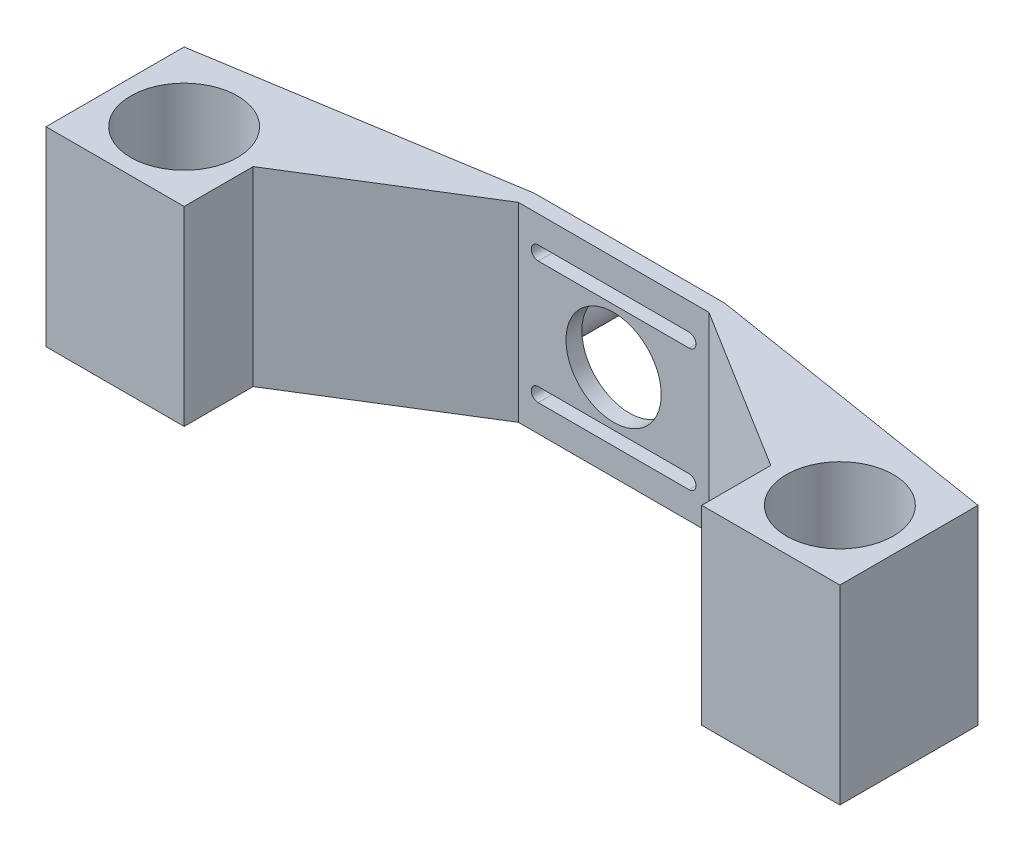
ISO-10303-21;
HEADER;
FILE_DESCRIPTION(('STEP AP214'),'2;1');
FILE_NAME('part.step','',(''),(''),'','','');
FILE_SCHEMA(('AUTOMOTIVE_DESIGN { 1 0 10303 214 1 1 1 1 }'));
ENDSEC;
DATA;
#1=APPLICATION_CONTEXT('core data for automotive mechanical design processes');
#2=APPLICATION_PROTOCOL_DEFINITION('international standard','automotive_design',2000,#1);
#3=PRODUCT_CONTEXT('',#1,'mechanical');
#4=PRODUCT('Part','Part','',(#3));
#5=PRODUCT_RELATED_PRODUCT_CATEGORY('part','',(#4));
#6=PRODUCT_DEFINITION_FORMATION('','',#4);
#7=PRODUCT_DEFINITION_CONTEXT('part definition',#1,'design');
#8=PRODUCT_DEFINITION('design','',#6,#7);
#9=PRODUCT_DEFINITION_SHAPE('','',#8);
#10=(LENGTH_UNIT() NAMED_UNIT(*) SI_UNIT(.MILLI.,.METRE.));
#11=(NAMED_UNIT(*) PLANE_ANGLE_UNIT() SI_UNIT($,.RADIAN.));
#12=(NAMED_UNIT(*) SI_UNIT($,.STERADIAN.) SOLID_ANGLE_UNIT());
#13=UNCERTAINTY_MEASURE_WITH_UNIT(LENGTH_MEASURE(1.E-05),#10,'distance_accuracy_value','');
#14=(GEOMETRIC_REPRESENTATION_CONTEXT(3) GLOBAL_UNCERTAINTY_ASSIGNED_CONTEXT((#13)) GLOBAL_UNIT_ASSIGNED_CONTEXT((#10,
#11,#12)) REPRESENTATION_CONTEXT('',''));
#15=CARTESIAN_POINT('',(0.,0.,0.));
#16=DIRECTION('',(0.,0.,1.));
#17=DIRECTION('',(1.,0.,0.));
#18=AXIS2_PLACEMENT_3D('',#15,#16,#17);
#19=CARTESIAN_POINT('',(82.6,48.,-29.6));
#20=DIRECTION('',(0.,0.,1.));
#21=DIRECTION('',(1.,0.,0.));
#22=AXIS2_PLACEMENT_3D('',#19,#20,#21);
#23=PLANE('',#22);
#24=DIRECTION('',(-1.,0.,0.));
#25=VECTOR('',#24,1.);
#26=CARTESIAN_POINT('',(101.6,6.8,-29.6));
#27=LINE('',#26,#25);
#28=CARTESIAN_POINT('',(101.6,6.8,-29.6));
#29=VERTEX_POINT('',#28);
#30=CARTESIAN_POINT('',(63.6,6.80000000000001,-29.6));
#31=VERTEX_POINT('',#30);
#32=EDGE_CURVE('E207',#29,#31,#27,.T.);
#33=ORIENTED_EDGE('',*,*,#32,.F.);
#34=CARTESIAN_POINT('',(101.6,8.55,-29.6));
#35=DIRECTION('',(0.,0.,-1.));
#36=DIRECTION('',(-1.,0.,0.));
#37=AXIS2_PLACEMENT_3D('',#34,#35,#36);
#38=CIRCLE('',#37,1.75);
#39=CARTESIAN_POINT('',(101.6,10.3,-29.6));
#40=VERTEX_POINT('',#39);
#41=EDGE_CURVE('E205',#40,#29,#38,.T.);
#42=ORIENTED_EDGE('',*,*,#41,.F.);
#43=DIRECTION('',(1.,0.,0.));
#44=VECTOR('',#43,1.);
#45=CARTESIAN_POINT('',(101.6,10.3,-29.6));
#46=LINE('',#45,#44);
#47=CARTESIAN_POINT('',(63.6,10.3,-29.6));
#48=VERTEX_POINT('',#47);
#49=EDGE_CURVE('E214',#48,#40,#46,.T.);
#50=ORIENTED_EDGE('',*,*,#49,.F.);
#51=CARTESIAN_POINT('',(63.6,8.55000000000001,-29.6));
#52=DIRECTION('',(0.,0.,-1.));
#53=DIRECTION('',(-1.,0.,0.));
#54=AXIS2_PLACEMENT_3D('',#51,#52,#53);
#55=CIRCLE('',#54,1.75);
#56=EDGE_CURVE('E211',#31,#48,#55,.T.);
#57=ORIENTED_EDGE('',*,*,#56,.F.);
#58=EDGE_LOOP('',(#33,#42,#50,#57));
#59=FACE_BOUND('',#58,.T.);
#60=DIRECTION('',(-1.,0.,0.));
#61=VECTOR('',#60,1.);
#62=CARTESIAN_POINT('',(101.6,37.7,-29.6));
#63=LINE('',#62,#61);
#64=CARTESIAN_POINT('',(101.6,37.7,-29.6));
#65=VERTEX_POINT('',#64);
#66=CARTESIAN_POINT('',(63.6,37.7,-29.6));
#67=VERTEX_POINT('',#66);
#68=EDGE_CURVE('E229',#65,#67,#63,.T.);
#69=ORIENTED_EDGE('',*,*,#68,.F.);
#70=CARTESIAN_POINT('',(101.6,39.45,-29.6));
#71=DIRECTION('',(0.,0.,-1.));
#72=DIRECTION('',(1.,0.,0.));
#73=AXIS2_PLACEMENT_3D('',#70,#71,#72);
#74=CIRCLE('',#73,1.75);
#75=CARTESIAN_POINT('',(101.6,41.2,-29.6));
#76=VERTEX_POINT('',#75);
#77=EDGE_CURVE('E227',#76,#65,#74,.T.);
#78=ORIENTED_EDGE('',*,*,#77,.F.);
#79=DIRECTION('',(1.,0.,0.));
#80=VECTOR('',#79,1.);
#81=CARTESIAN_POINT('',(101.6,41.2,-29.6));
#82=LINE('',#81,#80);
#83=CARTESIAN_POINT('',(63.6,41.2,-29.6));
#84=VERTEX_POINT('',#83);
#85=EDGE_CURVE('E235',#84,#76,#82,.T.);
#86=ORIENTED_EDGE('',*,*,#85,.F.);
#87=CARTESIAN_POINT('',(63.6,39.45,-29.6));
#88=DIRECTION('',(0.,0.,-1.));
#89=DIRECTION('',(1.,0.,0.));
#90=AXIS2_PLACEMENT_3D('',#87,#88,#89);
#91=CIRCLE('',#90,1.75);
#92=EDGE_CURVE('E232',#67,#84,#91,.T.);
#93=ORIENTED_EDGE('',*,*,#92,.F.);
#94=EDGE_LOOP('',(#69,#78,#86,#93));
#95=FACE_BOUND('',#94,.T.);
#96=CARTESIAN_POINT('',(82.6,24.,-29.6));
#97=DIRECTION('',(0.,0.,-1.));
#98=DIRECTION('',(-1.,0.,0.));
#99=AXIS2_PLACEMENT_3D('',#96,#97,#98);
#100=CIRCLE('',#99,12.);
#101=CARTESIAN_POINT('',(70.6,24.,-29.6));
#102=VERTEX_POINT('',#101);
#103=EDGE_CURVE('E199',#102,#102,#100,.T.);
#104=ORIENTED_EDGE('',*,*,#103,.F.);
#105=EDGE_LOOP('',(#104));
#106=FACE_BOUND('',#105,.T.);
#107=CARTESIAN_POINT('',(62.1,24.,-29.6));
#108=DIRECTION('',(0.,0.,-1.));
#109=DIRECTION('',(-1.,0.,0.));
#110=AXIS2_PLACEMENT_3D('',#107,#108,#109);
#111=CIRCLE('',#110,7.00000000000001);
#112=CARTESIAN_POINT('',(58.6,30.0621778264911,-29.6));
#113=VERTEX_POINT('',#112);
#114=CARTESIAN_POINT('',(58.6,17.9378221735089,-29.6));
#115=VERTEX_POINT('',#114);
#116=EDGE_CURVE('E182',#113,#115,#111,.T.);
#117=ORIENTED_EDGE('',*,*,#116,.F.);
#118=DIRECTION('',(0.,-1.,0.));
#119=VECTOR('',#118,1.);
#120=CARTESIAN_POINT('',(58.6,48.,-29.6));
#121=LINE('',#120,#119);
#122=CARTESIAN_POINT('',(58.6,48.,-29.6));
#123=VERTEX_POINT('',#122);
#124=EDGE_CURVE('E185',#123,#113,#121,.T.);
#125=ORIENTED_EDGE('',*,*,#124,.F.);
#126=DIRECTION('',(-1.,0.,0.));
#127=VECTOR('',#126,1.);
#128=CARTESIAN_POINT('',(82.6,48.,-29.6));
#129=LINE('',#128,#127);
#130=CARTESIAN_POINT('',(106.6,48.,-29.6));
#131=VERTEX_POINT('',#130);
#132=EDGE_CURVE('E343',#131,#123,#129,.T.);
#133=ORIENTED_EDGE('',*,*,#132,.F.);
#134=DIRECTION('',(0.,-1.,0.));
#135=VECTOR('',#134,1.);
#136=CARTESIAN_POINT('',(106.6,48.,-29.6));
#137=LINE('',#136,#135);
#138=CARTESIAN_POINT('',(106.6,0.,-29.6));
#139=VERTEX_POINT('',#138);
#140=EDGE_CURVE('E319',#131,#139,#137,.T.);
#141=ORIENTED_EDGE('',*,*,#140,.T.);
#142=DIRECTION('',(-1.,0.,0.));
#143=VECTOR('',#142,1.);
#144=CARTESIAN_POINT('',(82.6,0.,-29.6));
#145=LINE('',#144,#143);
#146=CARTESIAN_POINT('',(58.6,0.,-29.6));
#147=VERTEX_POINT('',#146);
#148=EDGE_CURVE('E357',#139,#147,#145,.T.);
#149=ORIENTED_EDGE('',*,*,#148,.T.);
#150=EDGE_CURVE('E193',#115,#147,#121,.T.);
#151=ORIENTED_EDGE('',*,*,#150,.F.);
#152=EDGE_LOOP('',(#117,#125,#133,#141,#149,#151));
#153=FACE_BOUND('',#152,.T.);
#154=ADVANCED_FACE('F33',(#59,#95,#106,#153),#23,.F.);
#155=CARTESIAN_POINT('',(0.,48.,0.));
#156=DIRECTION('',(0.,1.,0.));
#157=DIRECTION('',(0.,0.,1.));
#158=AXIS2_PLACEMENT_3D('',#155,#156,#157);
#159=PLANE('',#158);
#160=DIRECTION('',(0.,0.,1.));
#161=VECTOR('',#160,1.);
#162=CARTESIAN_POINT('',(-17.4,48.,17.4));
#163=LINE('',#162,#161);
#164=CARTESIAN_POINT('',(-17.4,48.,-17.4));
#165=VERTEX_POINT('',#164);
#166=CARTESIAN_POINT('',(-17.4,48.,17.4));
#167=VERTEX_POINT('',#166);
#168=EDGE_CURVE('E331',#165,#167,#163,.T.);
#169=ORIENTED_EDGE('',*,*,#168,.T.);
#170=DIRECTION('',(1.,0.,0.));
#171=VECTOR('',#170,1.);
#172=CARTESIAN_POINT('',(-17.4,48.,17.4));
#173=LINE('',#172,#171);
#174=CARTESIAN_POINT('',(17.4,48.,17.4));
#175=VERTEX_POINT('',#174);
#176=EDGE_CURVE('E334',#167,#175,#173,.T.);
#177=ORIENTED_EDGE('',*,*,#176,.T.);
#178=DIRECTION('',(0.,0.,-1.));
#179=VECTOR('',#178,1.);
#180=CARTESIAN_POINT('',(17.4,48.,17.4));
#181=LINE('',#180,#179);
#182=CARTESIAN_POINT('',(17.4,48.,0.));
#183=VERTEX_POINT('',#182);
#184=EDGE_CURVE('E337',#175,#183,#181,.T.);
#185=ORIENTED_EDGE('',*,*,#184,.T.);
#186=DIRECTION('',(0.849385240816697,0.,-0.527773353517171));
#187=VECTOR('',#186,1.);
#188=CARTESIAN_POINT('',(17.4,48.,0.));
#189=LINE('',#188,#187);
#190=CARTESIAN_POINT('',(58.6,48.,-25.6));
#191=VERTEX_POINT('',#190);
#192=EDGE_CURVE('E339',#183,#191,#189,.T.);
#193=ORIENTED_EDGE('',*,*,#192,.T.);
#194=DIRECTION('',(1.,0.,0.));
#195=VECTOR('',#194,1.);
#196=CARTESIAN_POINT('',(82.6,48.,-25.6));
#197=LINE('',#196,#195);
#198=CARTESIAN_POINT('',(106.6,48.,-25.6));
#199=VERTEX_POINT('',#198);
#200=EDGE_CURVE('E341',#191,#199,#197,.T.);
#201=ORIENTED_EDGE('',*,*,#200,.T.);
#202=DIRECTION('',(-0.849385240816697,0.,-0.527773353517171));
#203=VECTOR('',#202,1.);
#204=CARTESIAN_POINT('',(147.8,48.,0.));
#205=LINE('',#204,#203);
#206=CARTESIAN_POINT('',(147.8,48.,0.));
#207=VERTEX_POINT('',#206);
#208=EDGE_CURVE('E288',#207,#199,#205,.T.);
#209=ORIENTED_EDGE('',*,*,#208,.F.);
#210=DIRECTION('',(0.,0.,-1.));
#211=VECTOR('',#210,1.);
#212=CARTESIAN_POINT('',(147.8,48.,17.4));
#213=LINE('',#212,#211);
#214=CARTESIAN_POINT('',(147.8,48.,17.4));
#215=VERTEX_POINT('',#214);
#216=EDGE_CURVE('E291',#215,#207,#213,.T.);
#217=ORIENTED_EDGE('',*,*,#216,.F.);
#218=DIRECTION('',(-1.,0.,0.));
#219=VECTOR('',#218,1.);
#220=CARTESIAN_POINT('',(182.6,48.,17.4));
#221=LINE('',#220,#219);
#222=CARTESIAN_POINT('',(182.6,48.,17.4));
#223=VERTEX_POINT('',#222);
#224=EDGE_CURVE('E294',#223,#215,#221,.T.);
#225=ORIENTED_EDGE('',*,*,#224,.F.);
#226=DIRECTION('',(0.,0.,1.));
#227=VECTOR('',#226,1.);
#228=CARTESIAN_POINT('',(182.6,48.,17.4));
#229=LINE('',#228,#227);
#230=CARTESIAN_POINT('',(182.6,48.,-17.4));
#231=VERTEX_POINT('',#230);
#232=EDGE_CURVE('E281',#231,#223,#229,.T.);
#233=ORIENTED_EDGE('',*,*,#232,.F.);
#234=DIRECTION('',(0.98735943126704,0.,0.158497171861288));
#235=VECTOR('',#234,1.);
#236=CARTESIAN_POINT('',(106.6,48.,-29.6));
#237=LINE('',#236,#235);
#238=EDGE_CURVE('E284',#131,#231,#237,.T.);
#239=ORIENTED_EDGE('',*,*,#238,.F.);
#240=ORIENTED_EDGE('',*,*,#132,.T.);
#241=DIRECTION('',(-0.98735943126704,0.,0.158497171861288));
#242=VECTOR('',#241,1.);
#243=CARTESIAN_POINT('',(58.6,48.,-29.6));
#244=LINE('',#243,#242);
#245=EDGE_CURVE('E188',#123,#165,#244,.T.);
#246=ORIENTED_EDGE('',*,*,#245,.T.);
#247=EDGE_LOOP('',(#169,#177,#185,#193,#201,#209,#217,#225,#233,#239,#240,#246));
#248=FACE_BOUND('',#247,.T.);
#249=CARTESIAN_POINT('',(0.,48.,0.));
#250=DIRECTION('',(0.,1.,0.));
#251=DIRECTION('',(0.,0.,1.));
#252=AXIS2_PLACEMENT_3D('',#249,#250,#251);
#253=CIRCLE('',#252,13.45);
#254=CARTESIAN_POINT('',(0.,48.,13.45));
#255=VERTEX_POINT('',#254);
#256=EDGE_CURVE('E325',#255,#255,#253,.T.);
#257=ORIENTED_EDGE('',*,*,#256,.F.);
#258=EDGE_LOOP('',(#257));
#259=FACE_BOUND('',#258,.T.);
#260=CARTESIAN_POINT('',(165.2,48.,0.));
#261=DIRECTION('',(0.,-1.,0.));
#262=DIRECTION('',(0.,0.,1.));
#263=AXIS2_PLACEMENT_3D('',#260,#261,#262);
#264=CIRCLE('',#263,13.45);
#265=CARTESIAN_POINT('',(165.2,48.,13.45));
#266=VERTEX_POINT('',#265);
#267=EDGE_CURVE('E275',#266,#266,#264,.T.);
#268=ORIENTED_EDGE('',*,*,#267,.T.);
#269=EDGE_LOOP('',(#268));
#270=FACE_BOUND('',#269,.T.);
#271=ADVANCED_FACE('F392',(#248,#259,#270),#159,.T.);
#272=CARTESIAN_POINT('',(0.,0.,0.));
#273=DIRECTION('',(0.,1.,0.));
#274=DIRECTION('',(0.,0.,1.));
#275=AXIS2_PLACEMENT_3D('',#272,#273,#274);
#276=PLANE('',#275);
#277=DIRECTION('',(0.,0.,1.));
#278=VECTOR('',#277,1.);
#279=CARTESIAN_POINT('',(-17.4,0.,17.4));
#280=LINE('',#279,#278);
#281=CARTESIAN_POINT('',(-17.4,0.,-17.4));
#282=VERTEX_POINT('',#281);
#283=CARTESIAN_POINT('',(-17.4,0.,17.4));
#284=VERTEX_POINT('',#283);
#285=EDGE_CURVE('E328',#282,#284,#280,.T.);
#286=ORIENTED_EDGE('',*,*,#285,.F.);
#287=DIRECTION('',(-0.98735943126704,0.,0.158497171861288));
#288=VECTOR('',#287,1.);
#289=CARTESIAN_POINT('',(58.6,0.,-29.6));
#290=LINE('',#289,#288);
#291=EDGE_CURVE('E335',#147,#282,#290,.T.);
#292=ORIENTED_EDGE('',*,*,#291,.F.);
#293=ORIENTED_EDGE('',*,*,#148,.F.);
#294=DIRECTION('',(0.98735943126704,0.,0.158497171861288));
#295=VECTOR('',#294,1.);
#296=CARTESIAN_POINT('',(106.6,0.,-29.6));
#297=LINE('',#296,#295);
#298=CARTESIAN_POINT('',(182.6,0.,-17.4));
#299=VERTEX_POINT('',#298);
#300=EDGE_CURVE('E300',#139,#299,#297,.T.);
#301=ORIENTED_EDGE('',*,*,#300,.T.);
#302=DIRECTION('',(0.,0.,1.));
#303=VECTOR('',#302,1.);
#304=CARTESIAN_POINT('',(182.6,0.,17.4));
#305=LINE('',#304,#303);
#306=CARTESIAN_POINT('',(182.6,0.,17.4));
#307=VERTEX_POINT('',#306);
#308=EDGE_CURVE('E278',#299,#307,#305,.T.);
#309=ORIENTED_EDGE('',*,*,#308,.T.);
#310=DIRECTION('',(-1.,0.,0.));
#311=VECTOR('',#310,1.);
#312=CARTESIAN_POINT('',(182.6,0.,17.4));
#313=LINE('',#312,#311);
#314=CARTESIAN_POINT('',(147.8,0.,17.4));
#315=VERTEX_POINT('',#314);
#316=EDGE_CURVE('E285',#307,#315,#313,.T.);
#317=ORIENTED_EDGE('',*,*,#316,.T.);
#318=DIRECTION('',(0.,0.,-1.));
#319=VECTOR('',#318,1.);
#320=CARTESIAN_POINT('',(147.8,0.,17.4));
#321=LINE('',#320,#319);
#322=CARTESIAN_POINT('',(147.8,0.,0.));
#323=VERTEX_POINT('',#322);
#324=EDGE_CURVE('E306',#315,#323,#321,.T.);
#325=ORIENTED_EDGE('',*,*,#324,.T.);
#326=DIRECTION('',(-0.849385240816697,0.,-0.527773353517171));
#327=VECTOR('',#326,1.);
#328=CARTESIAN_POINT('',(147.8,0.,0.));
#329=LINE('',#328,#327);
#330=CARTESIAN_POINT('',(106.6,0.,-25.6));
#331=VERTEX_POINT('',#330);
#332=EDGE_CURVE('E303',#323,#331,#329,.T.);
#333=ORIENTED_EDGE('',*,*,#332,.T.);
#334=DIRECTION('',(1.,0.,0.));
#335=VECTOR('',#334,1.);
#336=CARTESIAN_POINT('',(82.6,0.,-25.6));
#337=LINE('',#336,#335);
#338=CARTESIAN_POINT('',(58.6,0.,-25.6));
#339=VERTEX_POINT('',#338);
#340=EDGE_CURVE('E355',#339,#331,#337,.T.);
#341=ORIENTED_EDGE('',*,*,#340,.F.);
#342=DIRECTION('',(0.849385240816697,0.,-0.527773353517171));
#343=VECTOR('',#342,1.);
#344=CARTESIAN_POINT('',(17.4,0.,0.));
#345=LINE('',#344,#343);
#346=CARTESIAN_POINT('',(17.4,0.,0.));
#347=VERTEX_POINT('',#346);
#348=EDGE_CURVE('E353',#347,#339,#345,.T.);
#349=ORIENTED_EDGE('',*,*,#348,.F.);
#350=DIRECTION('',(0.,0.,-1.));
#351=VECTOR('',#350,1.);
#352=CARTESIAN_POINT('',(17.4,0.,17.4));
#353=LINE('',#352,#351);
#354=CARTESIAN_POINT('',(17.4,0.,17.4));
#355=VERTEX_POINT('',#354);
#356=EDGE_CURVE('E351',#355,#347,#353,.T.);
#357=ORIENTED_EDGE('',*,*,#356,.F.);
#358=DIRECTION('',(1.,0.,0.));
#359=VECTOR('',#358,1.);
#360=CARTESIAN_POINT('',(-17.4,0.,17.4));
#361=LINE('',#360,#359);
#362=EDGE_CURVE('E349',#284,#355,#361,.T.);
#363=ORIENTED_EDGE('',*,*,#362,.F.);
#364=EDGE_LOOP('',(#286,#292,#293,#301,#309,#317,#325,#333,#341,#349,#357,#363));
#365=FACE_BOUND('',#364,.T.);
#366=CARTESIAN_POINT('',(0.,0.,0.));
#367=DIRECTION('',(0.,1.,0.));
#368=DIRECTION('',(0.,0.,1.));
#369=AXIS2_PLACEMENT_3D('',#366,#367,#368);
#370=CIRCLE('',#369,13.45);
#371=CARTESIAN_POINT('',(0.,0.,13.45));
#372=VERTEX_POINT('',#371);
#373=EDGE_CURVE('E324',#372,#372,#370,.T.);
#374=ORIENTED_EDGE('',*,*,#373,.T.);
#375=EDGE_LOOP('',(#374));
#376=FACE_BOUND('',#375,.T.);
#377=CARTESIAN_POINT('',(165.2,0.,0.));
#378=DIRECTION('',(0.,-1.,0.));
#379=DIRECTION('',(0.,0.,1.));
#380=AXIS2_PLACEMENT_3D('',#377,#378,#379);
#381=CIRCLE('',#380,13.45);
#382=CARTESIAN_POINT('',(165.2,0.,13.45));
#383=VERTEX_POINT('',#382);
#384=EDGE_CURVE('E274',#383,#383,#381,.T.);
#385=ORIENTED_EDGE('',*,*,#384,.F.);
#386=EDGE_LOOP('',(#385));
#387=FACE_BOUND('',#386,.T.);
#388=ADVANCED_FACE('F385',(#365,#376,#387),#276,.F.);
#389=CARTESIAN_POINT('',(-17.4,48.,17.4));
#390=DIRECTION('',(1.,0.,0.));
#391=DIRECTION('',(0.,0.,-1.));
#392=AXIS2_PLACEMENT_3D('',#389,#390,#391);
#393=PLANE('',#392);
#394=ORIENTED_EDGE('',*,*,#285,.T.);
#395=DIRECTION('',(0.,-1.,0.));
#396=VECTOR('',#395,1.);
#397=CARTESIAN_POINT('',(-17.4,48.,17.4));
#398=LINE('',#397,#396);
#399=EDGE_CURVE('E370',#167,#284,#398,.T.);
#400=ORIENTED_EDGE('',*,*,#399,.F.);
#401=ORIENTED_EDGE('',*,*,#168,.F.);
#402=DIRECTION('',(0.,-1.,0.));
#403=VECTOR('',#402,1.);
#404=CARTESIAN_POINT('',(-17.4,48.,-17.4));
#405=LINE('',#404,#403);
#406=EDGE_CURVE('E346',#165,#282,#405,.T.);
#407=ORIENTED_EDGE('',*,*,#406,.T.);
#408=EDGE_LOOP('',(#394,#400,#401,#407));
#409=FACE_BOUND('',#408,.T.);
#410=ADVANCED_FACE('F35',(#409),#393,.F.);
#411=CARTESIAN_POINT('',(-17.4,48.,17.4));
#412=DIRECTION('',(0.,0.,-1.));
#413=DIRECTION('',(-1.,0.,0.));
#414=AXIS2_PLACEMENT_3D('',#411,#412,#413);
#415=PLANE('',#414);
#416=ORIENTED_EDGE('',*,*,#362,.T.);
#417=DIRECTION('',(0.,-1.,0.));
#418=VECTOR('',#417,1.);
#419=CARTESIAN_POINT('',(17.4,48.,17.4));
#420=LINE('',#419,#418);
#421=EDGE_CURVE('E367',#175,#355,#420,.T.);
#422=ORIENTED_EDGE('',*,*,#421,.F.);
#423=ORIENTED_EDGE('',*,*,#176,.F.);
#424=ORIENTED_EDGE('',*,*,#399,.T.);
#425=EDGE_LOOP('',(#416,#422,#423,#424));
#426=FACE_BOUND('',#425,.T.);
#427=ADVANCED_FACE('F428',(#426),#415,.F.);
#428=CARTESIAN_POINT('',(17.4,48.,17.4));
#429=DIRECTION('',(-1.,0.,0.));
#430=DIRECTION('',(0.,0.,1.));
#431=AXIS2_PLACEMENT_3D('',#428,#429,#430);
#432=PLANE('',#431);
#433=ORIENTED_EDGE('',*,*,#356,.T.);
#434=DIRECTION('',(0.,-1.,0.));
#435=VECTOR('',#434,1.);
#436=CARTESIAN_POINT('',(17.4,48.,0.));
#437=LINE('',#436,#435);
#438=EDGE_CURVE('E364',#183,#347,#437,.T.);
#439=ORIENTED_EDGE('',*,*,#438,.F.);
#440=ORIENTED_EDGE('',*,*,#184,.F.);
#441=ORIENTED_EDGE('',*,*,#421,.T.);
#442=EDGE_LOOP('',(#433,#439,#440,#441));
#443=FACE_BOUND('',#442,.T.);
#444=ADVANCED_FACE('F425',(#443),#432,.F.);
#445=CARTESIAN_POINT('',(17.4,48.,0.));
#446=DIRECTION('',(-0.527773353517171,0.,-0.849385240816697));
#447=DIRECTION('',(-0.849385240816697,0.,0.527773353517171));
#448=AXIS2_PLACEMENT_3D('',#445,#446,#447);
#449=PLANE('',#448);
#450=ORIENTED_EDGE('',*,*,#348,.T.);
#451=DIRECTION('',(0.,-1.,0.));
#452=VECTOR('',#451,1.);
#453=CARTESIAN_POINT('',(58.6,48.,-25.6));
#454=LINE('',#453,#452);
#455=EDGE_CURVE('E190',#191,#339,#454,.T.);
#456=ORIENTED_EDGE('',*,*,#455,.F.);
#457=ORIENTED_EDGE('',*,*,#192,.F.);
#458=ORIENTED_EDGE('',*,*,#438,.T.);
#459=EDGE_LOOP('',(#450,#456,#457,#458));
#460=FACE_BOUND('',#459,.T.);
#461=ADVANCED_FACE('F422',(#460),#449,.F.);
#462=CARTESIAN_POINT('',(82.6,48.,-25.6));
#463=DIRECTION('',(0.,0.,-1.));
#464=DIRECTION('',(-1.,0.,0.));
#465=AXIS2_PLACEMENT_3D('',#462,#463,#464);
#466=PLANE('',#465);
#467=DIRECTION('',(1.,0.,0.));
#468=VECTOR('',#467,1.);
#469=CARTESIAN_POINT('',(82.6,10.3,-25.6));
#470=LINE('',#469,#468);
#471=CARTESIAN_POINT('',(63.6,10.3,-25.6));
#472=VERTEX_POINT('',#471);
#473=CARTESIAN_POINT('',(101.6,10.3,-25.6));
#474=VERTEX_POINT('',#473);
#475=EDGE_CURVE('E268',#472,#474,#470,.T.);
#476=ORIENTED_EDGE('',*,*,#475,.T.);
#477=CARTESIAN_POINT('',(101.6,8.55,-25.6));
#478=DIRECTION('',(0.,0.,-1.));
#479=DIRECTION('',(-1.,0.,0.));
#480=AXIS2_PLACEMENT_3D('',#477,#478,#479);
#481=CIRCLE('',#480,1.75);
#482=CARTESIAN_POINT('',(101.6,6.8,-25.6));
#483=VERTEX_POINT('',#482);
#484=EDGE_CURVE('E271',#474,#483,#481,.T.);
#485=ORIENTED_EDGE('',*,*,#484,.T.);
#486=DIRECTION('',(-1.,0.,0.));
#487=VECTOR('',#486,1.);
#488=CARTESIAN_POINT('',(82.6,6.80000000000001,-25.6));
#489=LINE('',#488,#487);
#490=CARTESIAN_POINT('',(63.6,6.80000000000001,-25.6));
#491=VERTEX_POINT('',#490);
#492=EDGE_CURVE('E262',#483,#491,#489,.T.);
#493=ORIENTED_EDGE('',*,*,#492,.T.);
#494=CARTESIAN_POINT('',(63.6,8.55000000000001,-25.6));
#495=DIRECTION('',(0.,0.,-1.));
#496=DIRECTION('',(-1.,0.,0.));
#497=AXIS2_PLACEMENT_3D('',#494,#495,#496);
#498=CIRCLE('',#497,1.75);
#499=EDGE_CURVE('E265',#491,#472,#498,.T.);
#500=ORIENTED_EDGE('',*,*,#499,.T.);
#501=EDGE_LOOP('',(#476,#485,#493,#500));
#502=FACE_BOUND('',#501,.T.);
#503=DIRECTION('',(1.,0.,0.));
#504=VECTOR('',#503,1.);
#505=CARTESIAN_POINT('',(82.6,41.2,-25.6));
#506=LINE('',#505,#504);
#507=CARTESIAN_POINT('',(63.6,41.2,-25.6));
#508=VERTEX_POINT('',#507);
#509=CARTESIAN_POINT('',(101.6,41.2,-25.6));
#510=VERTEX_POINT('',#509);
#511=EDGE_CURVE('E256',#508,#510,#506,.T.);
#512=ORIENTED_EDGE('',*,*,#511,.T.);
#513=CARTESIAN_POINT('',(101.6,39.45,-25.6));
#514=DIRECTION('',(0.,0.,-1.));
#515=DIRECTION('',(-1.,0.,0.));
#516=AXIS2_PLACEMENT_3D('',#513,#514,#515);
#517=CIRCLE('',#516,1.75);
#518=CARTESIAN_POINT('',(101.6,37.7,-25.6));
#519=VERTEX_POINT('',#518);
#520=EDGE_CURVE('E259',#510,#519,#517,.T.);
#521=ORIENTED_EDGE('',*,*,#520,.T.);
#522=DIRECTION('',(-1.,0.,0.));
#523=VECTOR('',#522,1.);
#524=CARTESIAN_POINT('',(82.6,37.7,-25.6));
#525=LINE('',#524,#523);
#526=CARTESIAN_POINT('',(63.6,37.7,-25.6));
#527=VERTEX_POINT('',#526);
#528=EDGE_CURVE('E250',#519,#527,#525,.T.);
#529=ORIENTED_EDGE('',*,*,#528,.T.);
#530=CARTESIAN_POINT('',(63.6,39.45,-25.6));
#531=DIRECTION('',(0.,0.,-1.));
#532=DIRECTION('',(-1.,0.,0.));
#533=AXIS2_PLACEMENT_3D('',#530,#531,#532);
#534=CIRCLE('',#533,1.75);
#535=EDGE_CURVE('E253',#527,#508,#534,.T.);
#536=ORIENTED_EDGE('',*,*,#535,.T.);
#537=EDGE_LOOP('',(#512,#521,#529,#536));
#538=FACE_BOUND('',#537,.T.);
#539=CARTESIAN_POINT('',(82.6,24.,-25.6));
#540=DIRECTION('',(0.,0.,-1.));
#541=DIRECTION('',(-1.,0.,0.));
#542=AXIS2_PLACEMENT_3D('',#539,#540,#541);
#543=CIRCLE('',#542,12.);
#544=CARTESIAN_POINT('',(70.6,24.,-25.6));
#545=VERTEX_POINT('',#544);
#546=EDGE_CURVE('E220',#545,#545,#543,.T.);
#547=ORIENTED_EDGE('',*,*,#546,.T.);
#548=EDGE_LOOP('',(#547));
#549=FACE_BOUND('',#548,.T.);
#550=ORIENTED_EDGE('',*,*,#340,.T.);
#551=DIRECTION('',(0.,-1.,0.));
#552=VECTOR('',#551,1.);
#553=CARTESIAN_POINT('',(106.6,48.,-25.6));
#554=LINE('',#553,#552);
#555=EDGE_CURVE('E316',#199,#331,#554,.T.);
#556=ORIENTED_EDGE('',*,*,#555,.F.);
#557=ORIENTED_EDGE('',*,*,#200,.F.);
#558=ORIENTED_EDGE('',*,*,#455,.T.);
#559=EDGE_LOOP('',(#550,#556,#557,#558));
#560=FACE_BOUND('',#559,.T.);
#561=ADVANCED_FACE('F418',(#502,#538,#549,#560),#466,.F.);
#562=CARTESIAN_POINT('',(58.6,48.,-29.6));
#563=DIRECTION('',(0.158497171861288,0.,0.98735943126704));
#564=DIRECTION('',(0.987359431267041,0.,-0.158497171861288));
#565=AXIS2_PLACEMENT_3D('',#562,#563,#564);
#566=PLANE('',#565);
#567=ORIENTED_EDGE('',*,*,#124,.T.);
#568=CARTESIAN_POINT('',(62.1,24.,-30.1618421052632));
#569=DIRECTION('',(0.158497171861288,0.,0.98735943126704));
#570=DIRECTION('',(0.987359431267041,0.,-0.158497171861288));
#571=AXIS2_PLACEMENT_3D('',#568,#569,#570);
#572=ELLIPSE('',#571,7.08961678830289,7.00000000000001);
#573=EDGE_CURVE('E11',#113,#115,#572,.T.);
#574=ORIENTED_EDGE('',*,*,#573,.T.);
#575=ORIENTED_EDGE('',*,*,#150,.T.);
#576=ORIENTED_EDGE('',*,*,#291,.T.);
#577=ORIENTED_EDGE('',*,*,#406,.F.);
#578=ORIENTED_EDGE('',*,*,#245,.F.);
#579=EDGE_LOOP('',(#567,#574,#575,#576,#577,#578));
#580=FACE_BOUND('',#579,.T.);
#581=ADVANCED_FACE('F186',(#580),#566,.F.);
#582=CARTESIAN_POINT('',(0.,48.,0.));
#583=DIRECTION('',(0.,-1.,0.));
#584=DIRECTION('',(0.,0.,-1.));
#585=AXIS2_PLACEMENT_3D('',#582,#583,#584);
#586=CYLINDRICAL_SURFACE('',#585,13.45);
#587=ORIENTED_EDGE('',*,*,#256,.T.);
#588=EDGE_LOOP('',(#587));
#589=FACE_BOUND('',#588,.T.);
#590=ORIENTED_EDGE('',*,*,#373,.F.);
#591=EDGE_LOOP('',(#590));
#592=FACE_BOUND('',#591,.T.);
#593=ADVANCED_FACE('F513',(#589,#592),#586,.F.);
#594=CARTESIAN_POINT('',(182.6,48.,17.4));
#595=DIRECTION('',(1.,0.,0.));
#596=DIRECTION('',(0.,0.,-1.));
#597=AXIS2_PLACEMENT_3D('',#594,#595,#596);
#598=PLANE('',#597);
#599=ORIENTED_EDGE('',*,*,#308,.F.);
#600=DIRECTION('',(0.,-1.,0.));
#601=VECTOR('',#600,1.);
#602=CARTESIAN_POINT('',(182.6,48.,-17.4));
#603=LINE('',#602,#601);
#604=EDGE_CURVE('E322',#231,#299,#603,.T.);
#605=ORIENTED_EDGE('',*,*,#604,.F.);
#606=ORIENTED_EDGE('',*,*,#232,.T.);
#607=DIRECTION('',(0.,-1.,0.));
#608=VECTOR('',#607,1.);
#609=CARTESIAN_POINT('',(182.6,48.,17.4));
#610=LINE('',#609,#608);
#611=EDGE_CURVE('E297',#223,#307,#610,.T.);
#612=ORIENTED_EDGE('',*,*,#611,.T.);
#613=EDGE_LOOP('',(#599,#605,#606,#612));
#614=FACE_BOUND('',#613,.T.);
#615=ADVANCED_FACE('F510',(#614),#598,.T.);
#616=CARTESIAN_POINT('',(106.6,48.,-29.6));
#617=DIRECTION('',(0.158497171861288,0.,-0.98735943126704));
#618=DIRECTION('',(-0.987359431267041,0.,-0.158497171861288));
#619=AXIS2_PLACEMENT_3D('',#616,#617,#618);
#620=PLANE('',#619);
#621=ORIENTED_EDGE('',*,*,#300,.F.);
#622=ORIENTED_EDGE('',*,*,#140,.F.);
#623=ORIENTED_EDGE('',*,*,#238,.T.);
#624=ORIENTED_EDGE('',*,*,#604,.T.);
#625=EDGE_LOOP('',(#621,#622,#623,#624));
#626=FACE_BOUND('',#625,.T.);
#627=ADVANCED_FACE('F398',(#626),#620,.T.);
#628=CARTESIAN_POINT('',(147.8,48.,0.));
#629=DIRECTION('',(-0.527773353517171,0.,0.849385240816697));
#630=DIRECTION('',(0.849385240816697,0.,0.527773353517171));
#631=AXIS2_PLACEMENT_3D('',#628,#629,#630);
#632=PLANE('',#631);
#633=ORIENTED_EDGE('',*,*,#332,.F.);
#634=DIRECTION('',(0.,-1.,0.));
#635=VECTOR('',#634,1.);
#636=CARTESIAN_POINT('',(147.8,48.,0.));
#637=LINE('',#636,#635);
#638=EDGE_CURVE('E314',#207,#323,#637,.T.);
#639=ORIENTED_EDGE('',*,*,#638,.F.);
#640=ORIENTED_EDGE('',*,*,#208,.T.);
#641=ORIENTED_EDGE('',*,*,#555,.T.);
#642=EDGE_LOOP('',(#633,#639,#640,#641));
#643=FACE_BOUND('',#642,.T.);
#644=ADVANCED_FACE('F413',(#643),#632,.T.);
#645=CARTESIAN_POINT('',(147.8,48.,17.4));
#646=DIRECTION('',(-1.,0.,0.));
#647=DIRECTION('',(0.,0.,1.));
#648=AXIS2_PLACEMENT_3D('',#645,#646,#647);
#649=PLANE('',#648);
#650=ORIENTED_EDGE('',*,*,#324,.F.);
#651=DIRECTION('',(0.,-1.,0.));
#652=VECTOR('',#651,1.);
#653=CARTESIAN_POINT('',(147.8,48.,17.4));
#654=LINE('',#653,#652);
#655=EDGE_CURVE('E312',#215,#315,#654,.T.);
#656=ORIENTED_EDGE('',*,*,#655,.F.);
#657=ORIENTED_EDGE('',*,*,#216,.T.);
#658=ORIENTED_EDGE('',*,*,#638,.T.);
#659=EDGE_LOOP('',(#650,#656,#657,#658));
#660=FACE_BOUND('',#659,.T.);
#661=ADVANCED_FACE('F408',(#660),#649,.T.);
#662=CARTESIAN_POINT('',(182.6,48.,17.4));
#663=DIRECTION('',(0.,0.,1.));
#664=DIRECTION('',(1.,0.,0.));
#665=AXIS2_PLACEMENT_3D('',#662,#663,#664);
#666=PLANE('',#665);
#667=ORIENTED_EDGE('',*,*,#316,.F.);
#668=ORIENTED_EDGE('',*,*,#611,.F.);
#669=ORIENTED_EDGE('',*,*,#224,.T.);
#670=ORIENTED_EDGE('',*,*,#655,.T.);
#671=EDGE_LOOP('',(#667,#668,#669,#670));
#672=FACE_BOUND('',#671,.T.);
#673=ADVANCED_FACE('F403',(#672),#666,.T.);
#674=CARTESIAN_POINT('',(165.2,48.,0.));
#675=DIRECTION('',(0.,-1.,0.));
#676=DIRECTION('',(0.,0.,-1.));
#677=AXIS2_PLACEMENT_3D('',#674,#675,#676);
#678=CYLINDRICAL_SURFACE('',#677,13.45);
#679=ORIENTED_EDGE('',*,*,#267,.F.);
#680=EDGE_LOOP('',(#679));
#681=FACE_BOUND('',#680,.T.);
#682=ORIENTED_EDGE('',*,*,#384,.T.);
#683=EDGE_LOOP('',(#682));
#684=FACE_BOUND('',#683,.T.);
#685=ADVANCED_FACE('F497',(#681,#684),#678,.F.);
#686=CARTESIAN_POINT('',(82.6,24.,18.4));
#687=DIRECTION('',(0.,0.,-1.));
#688=DIRECTION('',(-1.,0.,0.));
#689=AXIS2_PLACEMENT_3D('',#686,#687,#688);
#690=CYLINDRICAL_SURFACE('',#689,12.);
#691=ORIENTED_EDGE('',*,*,#103,.T.);
#692=EDGE_LOOP('',(#691));
#693=FACE_BOUND('',#692,.T.);
#694=ORIENTED_EDGE('',*,*,#546,.F.);
#695=EDGE_LOOP('',(#694));
#696=FACE_BOUND('',#695,.T.);
#697=ADVANCED_FACE('F493',(#693,#696),#690,.F.);
#698=CARTESIAN_POINT('',(101.6,39.45,18.4));
#699=DIRECTION('',(0.,0.,-1.));
#700=DIRECTION('',(-1.,0.,0.));
#701=AXIS2_PLACEMENT_3D('',#698,#699,#700);
#702=CYLINDRICAL_SURFACE('',#701,1.75);
#703=DIRECTION('',(0.,0.,-1.));
#704=VECTOR('',#703,1.);
#705=CARTESIAN_POINT('',(101.6,41.2,18.4));
#706=LINE('',#705,#704);
#707=EDGE_CURVE('E208',#510,#76,#706,.T.);
#708=ORIENTED_EDGE('',*,*,#707,.T.);
#709=ORIENTED_EDGE('',*,*,#77,.T.);
#710=DIRECTION('',(0.,0.,-1.));
#711=VECTOR('',#710,1.);
#712=CARTESIAN_POINT('',(101.6,37.7,18.4));
#713=LINE('',#712,#711);
#714=EDGE_CURVE('E238',#519,#65,#713,.T.);
#715=ORIENTED_EDGE('',*,*,#714,.F.);
#716=ORIENTED_EDGE('',*,*,#520,.F.);
#717=EDGE_LOOP('',(#708,#709,#715,#716));
#718=FACE_BOUND('',#717,.T.);
#719=ADVANCED_FACE('F483',(#718),#702,.F.);
#720=CARTESIAN_POINT('',(101.6,41.2,18.4));
#721=DIRECTION('',(0.,1.,0.));
#722=DIRECTION('',(-1.,0.,0.));
#723=AXIS2_PLACEMENT_3D('',#720,#721,#722);
#724=PLANE('',#723);
#725=DIRECTION('',(0.,0.,-1.));
#726=VECTOR('',#725,1.);
#727=CARTESIAN_POINT('',(63.6,41.2,18.4));
#728=LINE('',#727,#726);
#729=EDGE_CURVE('E240',#508,#84,#728,.T.);
#730=ORIENTED_EDGE('',*,*,#729,.T.);
#731=ORIENTED_EDGE('',*,*,#85,.T.);
#732=ORIENTED_EDGE('',*,*,#707,.F.);
#733=ORIENTED_EDGE('',*,*,#511,.F.);
#734=EDGE_LOOP('',(#730,#731,#732,#733));
#735=FACE_BOUND('',#734,.T.);
#736=ADVANCED_FACE('F479',(#735),#724,.F.);
#737=CARTESIAN_POINT('',(63.6,39.45,18.4));
#738=DIRECTION('',(0.,0.,-1.));
#739=DIRECTION('',(-1.,0.,0.));
#740=AXIS2_PLACEMENT_3D('',#737,#738,#739);
#741=CYLINDRICAL_SURFACE('',#740,1.75);
#742=DIRECTION('',(0.,0.,-1.));
#743=VECTOR('',#742,1.);
#744=CARTESIAN_POINT('',(63.6,37.7,18.4));
#745=LINE('',#744,#743);
#746=EDGE_CURVE('E242',#527,#67,#745,.T.);
#747=ORIENTED_EDGE('',*,*,#746,.T.);
#748=ORIENTED_EDGE('',*,*,#92,.T.);
#749=ORIENTED_EDGE('',*,*,#729,.F.);
#750=ORIENTED_EDGE('',*,*,#535,.F.);
#751=EDGE_LOOP('',(#747,#748,#749,#750));
#752=FACE_BOUND('',#751,.T.);
#753=ADVANCED_FACE('F482',(#752),#741,.F.);
#754=CARTESIAN_POINT('',(101.6,37.7,18.4));
#755=DIRECTION('',(0.,-1.,0.));
#756=DIRECTION('',(1.,0.,0.));
#757=AXIS2_PLACEMENT_3D('',#754,#755,#756);
#758=PLANE('',#757);
#759=ORIENTED_EDGE('',*,*,#714,.T.);
#760=ORIENTED_EDGE('',*,*,#68,.T.);
#761=ORIENTED_EDGE('',*,*,#746,.F.);
#762=ORIENTED_EDGE('',*,*,#528,.F.);
#763=EDGE_LOOP('',(#759,#760,#761,#762));
#764=FACE_BOUND('',#763,.T.);
#765=ADVANCED_FACE('F477',(#764),#758,.F.);
#766=CARTESIAN_POINT('',(101.6,8.55,18.4));
#767=DIRECTION('',(0.,0.,-1.));
#768=DIRECTION('',(-1.,0.,0.));
#769=AXIS2_PLACEMENT_3D('',#766,#767,#768);
#770=CYLINDRICAL_SURFACE('',#769,1.75);
#771=DIRECTION('',(0.,0.,-1.));
#772=VECTOR('',#771,1.);
#773=CARTESIAN_POINT('',(101.6,10.3,18.4));
#774=LINE('',#773,#772);
#775=EDGE_CURVE('E218',#474,#40,#774,.T.);
#776=ORIENTED_EDGE('',*,*,#775,.T.);
#777=ORIENTED_EDGE('',*,*,#41,.T.);
#778=DIRECTION('',(0.,0.,-1.));
#779=VECTOR('',#778,1.);
#780=CARTESIAN_POINT('',(101.6,6.8,18.4));
#781=LINE('',#780,#779);
#782=EDGE_CURVE('E217',#483,#29,#781,.T.);
#783=ORIENTED_EDGE('',*,*,#782,.F.);
#784=ORIENTED_EDGE('',*,*,#484,.F.);
#785=EDGE_LOOP('',(#776,#777,#783,#784));
#786=FACE_BOUND('',#785,.T.);
#787=ADVANCED_FACE('F467',(#786),#770,.F.);
#788=CARTESIAN_POINT('',(101.6,10.3,18.4));
#789=DIRECTION('',(0.,1.,0.));
#790=DIRECTION('',(-1.,0.,0.));
#791=AXIS2_PLACEMENT_3D('',#788,#789,#790);
#792=PLANE('',#791);
#793=DIRECTION('',(0.,0.,-1.));
#794=VECTOR('',#793,1.);
#795=CARTESIAN_POINT('',(63.6,10.3,18.4));
#796=LINE('',#795,#794);
#797=EDGE_CURVE('E221',#472,#48,#796,.T.);
#798=ORIENTED_EDGE('',*,*,#797,.T.);
#799=ORIENTED_EDGE('',*,*,#49,.T.);
#800=ORIENTED_EDGE('',*,*,#775,.F.);
#801=ORIENTED_EDGE('',*,*,#475,.F.);
#802=EDGE_LOOP('',(#798,#799,#800,#801));
#803=FACE_BOUND('',#802,.T.);
#804=ADVANCED_FACE('F463',(#803),#792,.F.);
#805=CARTESIAN_POINT('',(63.6,8.55000000000001,18.4));
#806=DIRECTION('',(0.,0.,-1.));
#807=DIRECTION('',(-1.,0.,0.));
#808=AXIS2_PLACEMENT_3D('',#805,#806,#807);
#809=CYLINDRICAL_SURFACE('',#808,1.75);
#810=DIRECTION('',(0.,0.,-1.));
#811=VECTOR('',#810,1.);
#812=CARTESIAN_POINT('',(63.6,6.80000000000001,18.4));
#813=LINE('',#812,#811);
#814=EDGE_CURVE('E223',#491,#31,#813,.T.);
#815=ORIENTED_EDGE('',*,*,#814,.T.);
#816=ORIENTED_EDGE('',*,*,#56,.T.);
#817=ORIENTED_EDGE('',*,*,#797,.F.);
#818=ORIENTED_EDGE('',*,*,#499,.F.);
#819=EDGE_LOOP('',(#815,#816,#817,#818));
#820=FACE_BOUND('',#819,.T.);
#821=ADVANCED_FACE('F466',(#820),#809,.F.);
#822=CARTESIAN_POINT('',(101.6,6.8,18.4));
#823=DIRECTION('',(0.,-1.,0.));
#824=DIRECTION('',(1.,0.,0.));
#825=AXIS2_PLACEMENT_3D('',#822,#823,#824);
#826=PLANE('',#825);
#827=ORIENTED_EDGE('',*,*,#782,.T.);
#828=ORIENTED_EDGE('',*,*,#32,.T.);
#829=ORIENTED_EDGE('',*,*,#814,.F.);
#830=ORIENTED_EDGE('',*,*,#492,.F.);
#831=EDGE_LOOP('',(#827,#828,#829,#830));
#832=FACE_BOUND('',#831,.T.);
#833=ADVANCED_FACE('F457',(#832),#826,.F.);
#834=CARTESIAN_POINT('',(62.1,24.,-27.6));
#835=DIRECTION('',(0.,0.,-1.));
#836=DIRECTION('',(-1.,0.,0.));
#837=AXIS2_PLACEMENT_3D('',#834,#835,#836);
#838=CYLINDRICAL_SURFACE('',#837,7.00000000000001);
#839=ORIENTED_EDGE('',*,*,#573,.F.);
#840=ORIENTED_EDGE('',*,*,#116,.T.);
#841=EDGE_LOOP('',(#839,#840));
#842=FACE_BOUND('',#841,.T.);
#843=CARTESIAN_POINT('',(62.1,24.,-42.6));
#844=DIRECTION('',(0.,0.,-1.));
#845=DIRECTION('',(-1.,0.,0.));
#846=AXIS2_PLACEMENT_3D('',#843,#844,#845);
#847=CIRCLE('',#846,7.00000000000001);
#848=CARTESIAN_POINT('',(55.1,24.,-42.6));
#849=VERTEX_POINT('',#848);
#850=EDGE_CURVE('E195',#849,#849,#847,.T.);
#851=ORIENTED_EDGE('',*,*,#850,.F.);
#852=EDGE_LOOP('',(#851));
#853=FACE_BOUND('',#852,.T.);
#854=ADVANCED_FACE('F179',(#842,#853),#838,.T.);
#855=CARTESIAN_POINT('',(62.1,24.,-42.6));
#856=DIRECTION('',(0.,0.,-1.));
#857=DIRECTION('',(-1.,0.,0.));
#858=AXIS2_PLACEMENT_3D('',#855,#856,#857);
#859=PLANE('',#858);
#860=ORIENTED_EDGE('',*,*,#850,.T.);
#861=EDGE_LOOP('',(#860));
#862=FACE_BOUND('',#861,.T.);
#863=CARTESIAN_POINT('',(62.1,24.,-42.6));
#864=DIRECTION('',(0.,0.,-1.));
#865=DIRECTION('',(-1.,0.,0.));
#866=AXIS2_PLACEMENT_3D('',#863,#864,#865);
#867=CIRCLE('',#866,4.00000000000001);
#868=CARTESIAN_POINT('',(58.1,24.,-42.6));
#869=VERTEX_POINT('',#868);
#870=EDGE_CURVE('E196',#869,#869,#867,.T.);
#871=ORIENTED_EDGE('',*,*,#870,.F.);
#872=EDGE_LOOP('',(#871));
#873=FACE_BOUND('',#872,.T.);
#874=ADVANCED_FACE('F447',(#862,#873),#859,.T.);
#875=CARTESIAN_POINT('',(58.6,25.9364916731037,-29.6));
#876=VERTEX_POINT('',#875);
#877=CARTESIAN_POINT('',(58.6,22.0635083268963,-29.6));
#878=VERTEX_POINT('',#877);
#879=EDGE_CURVE('E191',#876,#878,#121,.T.);
#880=ORIENTED_EDGE('',*,*,#879,.F.);
#881=CARTESIAN_POINT('',(62.1,24.,-29.6));
#882=DIRECTION('',(0.,0.,-1.));
#883=DIRECTION('',(-1.,0.,0.));
#884=AXIS2_PLACEMENT_3D('',#881,#882,#883);
#885=CIRCLE('',#884,4.00000000000001);
#886=EDGE_CURVE('E53',#876,#878,#885,.T.);
#887=ORIENTED_EDGE('',*,*,#886,.T.);
#888=EDGE_LOOP('',(#880,#887));
#889=FACE_BOUND('',#888,.T.);
#890=ADVANCED_FACE('F379',(#889),#23,.F.);
#891=CARTESIAN_POINT('',(62.1,24.,-30.1618421052632));
#892=DIRECTION('',(0.158497171861288,0.,0.98735943126704));
#893=DIRECTION('',(0.987359431267041,0.,-0.158497171861288));
#894=AXIS2_PLACEMENT_3D('',#891,#892,#893);
#895=ELLIPSE('',#894,4.05120959331594,4.00000000000001);
#896=EDGE_CURVE('E41',#876,#878,#895,.T.);
#897=ORIENTED_EDGE('',*,*,#896,.F.);
#898=ORIENTED_EDGE('',*,*,#879,.T.);
#899=EDGE_LOOP('',(#897,#898));
#900=FACE_BOUND('',#899,.T.);
#901=ADVANCED_FACE('F377',(#900),#566,.F.);
#902=CARTESIAN_POINT('',(62.1,24.,-27.6));
#903=DIRECTION('',(0.,0.,-1.));
#904=DIRECTION('',(-1.,0.,0.));
#905=AXIS2_PLACEMENT_3D('',#902,#903,#904);
#906=CYLINDRICAL_SURFACE('',#905,4.00000000000001);
#907=ORIENTED_EDGE('',*,*,#896,.T.);
#908=ORIENTED_EDGE('',*,*,#886,.F.);
#909=EDGE_LOOP('',(#907,#908));
#910=FACE_BOUND('',#909,.T.);
#911=ORIENTED_EDGE('',*,*,#870,.T.);
#912=EDGE_LOOP('',(#911));
#913=FACE_BOUND('',#912,.T.);
#914=ADVANCED_FACE('F372',(#910,#913),#906,.F.);
#915=CLOSED_SHELL('',(#154,#271,#388,#410,#427,#444,#461,#561,#581,#593,#615,#627,#644,#661,
#673,#685,#697,#719,#736,#753,#765,#787,#804,#821,#833,#854,#874,#890,#901,#914));
#916=MANIFOLD_SOLID_BREP('B2',#915);
#917=ADVANCED_BREP_SHAPE_REPRESENTATION('',(#18,#916),#14);
#918=SHAPE_DEFINITION_REPRESENTATION(#9,#917);
ENDSEC;
END-ISO-10303-21;
